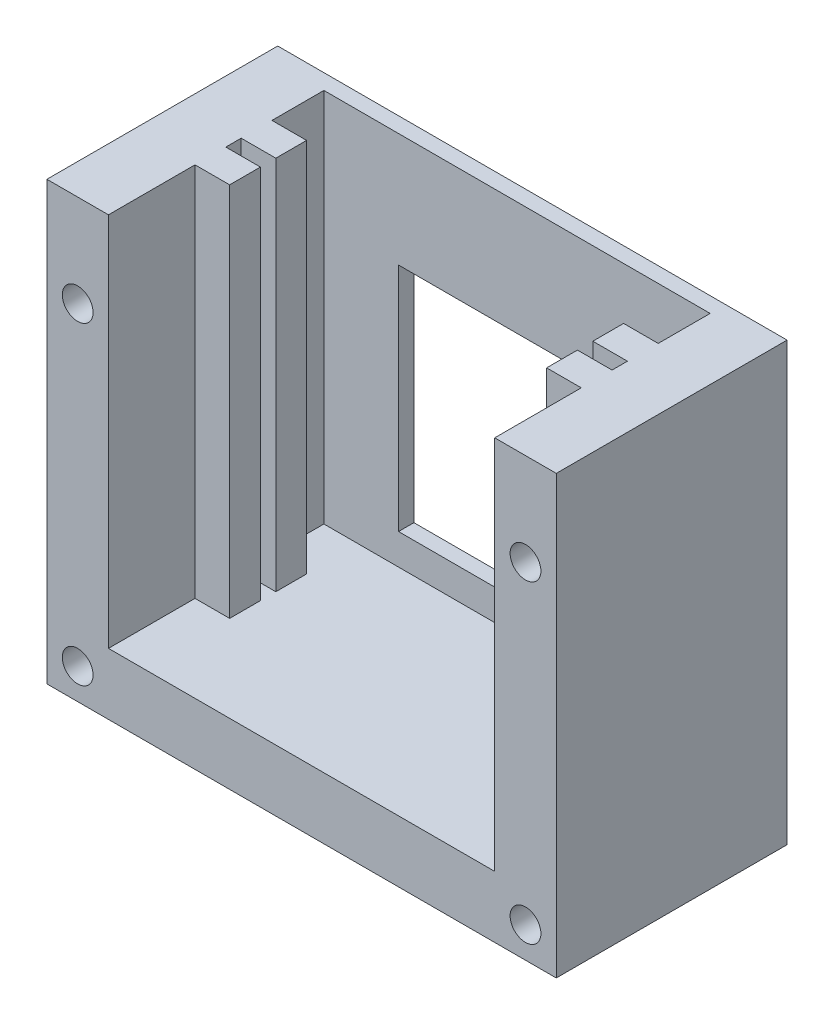
ISO-10303-21;
HEADER;
FILE_DESCRIPTION(('STEP AP214'),'2;1');
FILE_NAME('part.step','',(''),(''),'','','');
FILE_SCHEMA(('AUTOMOTIVE_DESIGN { 1 0 10303 214 1 1 1 1 }'));
ENDSEC;
DATA;
#1=APPLICATION_CONTEXT('core data for automotive mechanical design processes');
#2=APPLICATION_PROTOCOL_DEFINITION('international standard','automotive_design',2000,#1);
#3=PRODUCT_CONTEXT('',#1,'mechanical');
#4=PRODUCT('Part','Part','',(#3));
#5=PRODUCT_RELATED_PRODUCT_CATEGORY('part','',(#4));
#6=PRODUCT_DEFINITION_FORMATION('','',#4);
#7=PRODUCT_DEFINITION_CONTEXT('part definition',#1,'design');
#8=PRODUCT_DEFINITION('design','',#6,#7);
#9=PRODUCT_DEFINITION_SHAPE('','',#8);
#10=(LENGTH_UNIT() NAMED_UNIT(*) SI_UNIT(.MILLI.,.METRE.));
#11=(NAMED_UNIT(*) PLANE_ANGLE_UNIT() SI_UNIT($,.RADIAN.));
#12=(NAMED_UNIT(*) SI_UNIT($,.STERADIAN.) SOLID_ANGLE_UNIT());
#13=UNCERTAINTY_MEASURE_WITH_UNIT(LENGTH_MEASURE(1.E-05),#10,'distance_accuracy_value','');
#14=(GEOMETRIC_REPRESENTATION_CONTEXT(3) GLOBAL_UNCERTAINTY_ASSIGNED_CONTEXT((#13)) GLOBAL_UNIT_ASSIGNED_CONTEXT((#10,
#11,#12)) REPRESENTATION_CONTEXT('',''));
#15=CARTESIAN_POINT('',(0.,0.,0.));
#16=DIRECTION('',(0.,0.,1.));
#17=DIRECTION('',(1.,0.,0.));
#18=AXIS2_PLACEMENT_3D('',#15,#16,#17);
#19=CARTESIAN_POINT('',(-14.35,8.9,-17.));
#20=DIRECTION('',(0.,0.,1.));
#21=DIRECTION('',(1.,0.,0.));
#22=AXIS2_PLACEMENT_3D('',#19,#20,#21);
#23=CYLINDRICAL_SURFACE('',#22,1.);
#24=CARTESIAN_POINT('',(-14.35,8.9,-15.));
#25=DIRECTION('',(0.,0.,-1.));
#26=DIRECTION('',(-1.,0.,0.));
#27=AXIS2_PLACEMENT_3D('',#24,#25,#26);
#28=CIRCLE('',#27,1.);
#29=CARTESIAN_POINT('',(-15.35,8.9,-15.));
#30=VERTEX_POINT('',#29);
#31=EDGE_CURVE('E355',#30,#30,#28,.T.);
#32=ORIENTED_EDGE('',*,*,#31,.T.);
#33=EDGE_LOOP('',(#32));
#34=FACE_BOUND('',#33,.T.);
#35=CARTESIAN_POINT('',(-14.35,8.9,0.));
#36=DIRECTION('',(0.,0.,1.));
#37=DIRECTION('',(1.,0.,0.));
#38=AXIS2_PLACEMENT_3D('',#35,#36,#37);
#39=CIRCLE('',#38,1.);
#40=CARTESIAN_POINT('',(-13.35,8.9,0.));
#41=VERTEX_POINT('',#40);
#42=EDGE_CURVE('E360',#41,#41,#39,.F.);
#43=ORIENTED_EDGE('',*,*,#42,.F.);
#44=EDGE_LOOP('',(#43));
#45=FACE_BOUND('',#44,.T.);
#46=ADVANCED_FACE('F40',(#34,#45),#23,.F.);
#47=CARTESIAN_POINT('',(-14.35,-11.5,-17.));
#48=DIRECTION('',(0.,0.,1.));
#49=DIRECTION('',(1.,0.,0.));
#50=AXIS2_PLACEMENT_3D('',#47,#48,#49);
#51=CYLINDRICAL_SURFACE('',#50,1.);
#52=CARTESIAN_POINT('',(-14.35,-11.5,-15.));
#53=DIRECTION('',(0.,0.,-1.));
#54=DIRECTION('',(-1.,0.,0.));
#55=AXIS2_PLACEMENT_3D('',#52,#53,#54);
#56=CIRCLE('',#55,1.);
#57=CARTESIAN_POINT('',(-15.35,-11.5,-15.));
#58=VERTEX_POINT('',#57);
#59=EDGE_CURVE('E359',#58,#58,#56,.T.);
#60=ORIENTED_EDGE('',*,*,#59,.T.);
#61=EDGE_LOOP('',(#60));
#62=FACE_BOUND('',#61,.T.);
#63=CARTESIAN_POINT('',(-14.35,-11.5,0.));
#64=DIRECTION('',(0.,0.,1.));
#65=DIRECTION('',(1.,0.,0.));
#66=AXIS2_PLACEMENT_3D('',#63,#64,#65);
#67=CIRCLE('',#66,1.);
#68=CARTESIAN_POINT('',(-13.35,-11.5,0.));
#69=VERTEX_POINT('',#68);
#70=EDGE_CURVE('E1050',#69,#69,#67,.F.);
#71=ORIENTED_EDGE('',*,*,#70,.F.);
#72=EDGE_LOOP('',(#71));
#73=FACE_BOUND('',#72,.T.);
#74=ADVANCED_FACE('F620',(#62,#73),#51,.F.);
#75=CARTESIAN_POINT('',(14.75,-11.5,-17.));
#76=DIRECTION('',(0.,0.,1.));
#77=DIRECTION('',(1.,0.,0.));
#78=AXIS2_PLACEMENT_3D('',#75,#76,#77);
#79=CYLINDRICAL_SURFACE('',#78,1.);
#80=CARTESIAN_POINT('',(14.75,-11.5,-15.));
#81=DIRECTION('',(0.,0.,-1.));
#82=DIRECTION('',(-1.,0.,0.));
#83=AXIS2_PLACEMENT_3D('',#80,#81,#82);
#84=CIRCLE('',#83,1.);
#85=CARTESIAN_POINT('',(13.75,-11.5,-15.));
#86=VERTEX_POINT('',#85);
#87=EDGE_CURVE('E364',#86,#86,#84,.T.);
#88=ORIENTED_EDGE('',*,*,#87,.T.);
#89=EDGE_LOOP('',(#88));
#90=FACE_BOUND('',#89,.T.);
#91=CARTESIAN_POINT('',(14.75,-11.5,0.));
#92=DIRECTION('',(0.,0.,1.));
#93=DIRECTION('',(1.,0.,0.));
#94=AXIS2_PLACEMENT_3D('',#91,#92,#93);
#95=CIRCLE('',#94,1.);
#96=CARTESIAN_POINT('',(15.75,-11.5,0.));
#97=VERTEX_POINT('',#96);
#98=EDGE_CURVE('E1047',#97,#97,#95,.F.);
#99=ORIENTED_EDGE('',*,*,#98,.F.);
#100=EDGE_LOOP('',(#99));
#101=FACE_BOUND('',#100,.T.);
#102=ADVANCED_FACE('F627',(#90,#101),#79,.F.);
#103=CARTESIAN_POINT('',(14.75,8.9,-17.));
#104=DIRECTION('',(0.,0.,1.));
#105=DIRECTION('',(1.,0.,0.));
#106=AXIS2_PLACEMENT_3D('',#103,#104,#105);
#107=CYLINDRICAL_SURFACE('',#106,1.);
#108=CARTESIAN_POINT('',(14.75,8.9,-15.));
#109=DIRECTION('',(0.,0.,-1.));
#110=DIRECTION('',(-1.,0.,0.));
#111=AXIS2_PLACEMENT_3D('',#108,#109,#110);
#112=CIRCLE('',#111,1.);
#113=CARTESIAN_POINT('',(13.75,8.9,-15.));
#114=VERTEX_POINT('',#113);
#115=EDGE_CURVE('E367',#114,#114,#112,.T.);
#116=ORIENTED_EDGE('',*,*,#115,.T.);
#117=EDGE_LOOP('',(#116));
#118=FACE_BOUND('',#117,.T.);
#119=CARTESIAN_POINT('',(14.75,8.9,0.));
#120=DIRECTION('',(0.,0.,1.));
#121=DIRECTION('',(1.,0.,0.));
#122=AXIS2_PLACEMENT_3D('',#119,#120,#121);
#123=CIRCLE('',#122,1.);
#124=CARTESIAN_POINT('',(15.75,8.9,0.));
#125=VERTEX_POINT('',#124);
#126=EDGE_CURVE('E44',#125,#125,#123,.F.);
#127=ORIENTED_EDGE('',*,*,#126,.F.);
#128=EDGE_LOOP('',(#127));
#129=FACE_BOUND('',#128,.T.);
#130=ADVANCED_FACE('F633',(#118,#129),#107,.F.);
#131=CARTESIAN_POINT('',(0.,-9.5,-15.));
#132=DIRECTION('',(0.,1.,0.));
#133=DIRECTION('',(0.,0.,1.));
#134=AXIS2_PLACEMENT_3D('',#131,#132,#133);
#135=PLANE('',#134);
#136=DIRECTION('',(0.,0.,1.));
#137=VECTOR('',#136,1.);
#138=CARTESIAN_POINT('',(12.75,-9.5,-15.));
#139=LINE('',#138,#137);
#140=CARTESIAN_POINT('',(12.75,-9.5,-14.));
#141=VERTEX_POINT('',#140);
#142=CARTESIAN_POINT('',(12.75,-9.5,-10.625));
#143=VERTEX_POINT('',#142);
#144=EDGE_CURVE('E308',#141,#143,#139,.T.);
#145=ORIENTED_EDGE('',*,*,#144,.F.);
#146=DIRECTION('',(-1.,0.,0.));
#147=VECTOR('',#146,1.);
#148=CARTESIAN_POINT('',(0.,-9.5,-14.));
#149=LINE('',#148,#147);
#150=CARTESIAN_POINT('',(-12.35,-9.5,-14.));
#151=VERTEX_POINT('',#150);
#152=EDGE_CURVE('E433',#141,#151,#149,.T.);
#153=ORIENTED_EDGE('',*,*,#152,.T.);
#154=DIRECTION('',(0.,0.,1.));
#155=VECTOR('',#154,1.);
#156=CARTESIAN_POINT('',(-12.35,-9.5,-15.));
#157=LINE('',#156,#155);
#158=CARTESIAN_POINT('',(-12.35,-9.5,-10.625));
#159=VERTEX_POINT('',#158);
#160=EDGE_CURVE('E313',#151,#159,#157,.T.);
#161=ORIENTED_EDGE('',*,*,#160,.T.);
#162=DIRECTION('',(-1.,0.,0.));
#163=VECTOR('',#162,1.);
#164=CARTESIAN_POINT('',(0.,-9.5,-10.625));
#165=LINE('',#164,#163);
#166=CARTESIAN_POINT('',(-10.1,-9.5,-10.625));
#167=VERTEX_POINT('',#166);
#168=EDGE_CURVE('E523',#167,#159,#165,.T.);
#169=ORIENTED_EDGE('',*,*,#168,.F.);
#170=DIRECTION('',(0.,0.,-1.));
#171=VECTOR('',#170,1.);
#172=CARTESIAN_POINT('',(-10.1,-9.5,-15.));
#173=LINE('',#172,#171);
#174=CARTESIAN_POINT('',(-10.1,-9.5,-8.625));
#175=VERTEX_POINT('',#174);
#176=EDGE_CURVE('E541',#175,#167,#173,.T.);
#177=ORIENTED_EDGE('',*,*,#176,.F.);
#178=DIRECTION('',(-1.,0.,0.));
#179=VECTOR('',#178,1.);
#180=CARTESIAN_POINT('',(0.,-9.5,-8.625));
#181=LINE('',#180,#179);
#182=CARTESIAN_POINT('',(-12.35,-9.5,-8.625));
#183=VERTEX_POINT('',#182);
#184=EDGE_CURVE('E537',#175,#183,#181,.T.);
#185=ORIENTED_EDGE('',*,*,#184,.T.);
#186=CARTESIAN_POINT('',(-12.35,-9.5,-7.625));
#187=VERTEX_POINT('',#186);
#188=EDGE_CURVE('E317',#183,#187,#157,.T.);
#189=ORIENTED_EDGE('',*,*,#188,.T.);
#190=DIRECTION('',(-1.,0.,0.));
#191=VECTOR('',#190,1.);
#192=CARTESIAN_POINT('',(0.,-9.5,-7.625));
#193=LINE('',#192,#191);
#194=CARTESIAN_POINT('',(-10.1,-9.5,-7.625));
#195=VERTEX_POINT('',#194);
#196=EDGE_CURVE('E334',#195,#187,#193,.T.);
#197=ORIENTED_EDGE('',*,*,#196,.F.);
#198=DIRECTION('',(0.,0.,1.));
#199=VECTOR('',#198,1.);
#200=CARTESIAN_POINT('',(-10.1,-9.5,-15.));
#201=LINE('',#200,#199);
#202=CARTESIAN_POINT('',(-10.1,-9.5,-5.625));
#203=VERTEX_POINT('',#202);
#204=EDGE_CURVE('E330',#195,#203,#201,.T.);
#205=ORIENTED_EDGE('',*,*,#204,.T.);
#206=DIRECTION('',(-1.,0.,0.));
#207=VECTOR('',#206,1.);
#208=CARTESIAN_POINT('',(0.,-9.5,-5.62500000000001));
#209=LINE('',#208,#207);
#210=CARTESIAN_POINT('',(-12.35,-9.5,-5.625));
#211=VERTEX_POINT('',#210);
#212=EDGE_CURVE('E338',#203,#211,#209,.T.);
#213=ORIENTED_EDGE('',*,*,#212,.T.);
#214=CARTESIAN_POINT('',(-12.35,-9.5,0.));
#215=VERTEX_POINT('',#214);
#216=EDGE_CURVE('E311',#211,#215,#157,.T.);
#217=ORIENTED_EDGE('',*,*,#216,.T.);
#218=DIRECTION('',(-1.,0.,0.));
#219=VECTOR('',#218,1.);
#220=CARTESIAN_POINT('',(0.,-9.5,0.));
#221=LINE('',#220,#219);
#222=CARTESIAN_POINT('',(12.75,-9.5,0.));
#223=VERTEX_POINT('',#222);
#224=EDGE_CURVE('E295',#223,#215,#221,.T.);
#225=ORIENTED_EDGE('',*,*,#224,.F.);
#226=CARTESIAN_POINT('',(12.75,-9.5,-5.625));
#227=VERTEX_POINT('',#226);
#228=EDGE_CURVE('E305',#227,#223,#139,.T.);
#229=ORIENTED_EDGE('',*,*,#228,.F.);
#230=DIRECTION('',(1.,0.,0.));
#231=VECTOR('',#230,1.);
#232=CARTESIAN_POINT('',(10.5,-9.5,-5.625));
#233=LINE('',#232,#231);
#234=CARTESIAN_POINT('',(10.5,-9.5,-5.625));
#235=VERTEX_POINT('',#234);
#236=EDGE_CURVE('E466',#235,#227,#233,.T.);
#237=ORIENTED_EDGE('',*,*,#236,.F.);
#238=DIRECTION('',(0.,0.,1.));
#239=VECTOR('',#238,1.);
#240=CARTESIAN_POINT('',(10.5,-9.5,-7.625));
#241=LINE('',#240,#239);
#242=CARTESIAN_POINT('',(10.5,-9.5,-7.625));
#243=VERTEX_POINT('',#242);
#244=EDGE_CURVE('E445',#243,#235,#241,.T.);
#245=ORIENTED_EDGE('',*,*,#244,.F.);
#246=DIRECTION('',(1.,0.,0.));
#247=VECTOR('',#246,1.);
#248=CARTESIAN_POINT('',(10.5,-9.5,-7.625));
#249=LINE('',#248,#247);
#250=CARTESIAN_POINT('',(12.75,-9.5,-7.625));
#251=VERTEX_POINT('',#250);
#252=EDGE_CURVE('E469',#243,#251,#249,.T.);
#253=ORIENTED_EDGE('',*,*,#252,.T.);
#254=CARTESIAN_POINT('',(12.75,-9.5,-8.625));
#255=VERTEX_POINT('',#254);
#256=EDGE_CURVE('E312',#255,#251,#139,.T.);
#257=ORIENTED_EDGE('',*,*,#256,.F.);
#258=DIRECTION('',(1.,0.,0.));
#259=VECTOR('',#258,1.);
#260=CARTESIAN_POINT('',(10.5,-9.5,-8.625));
#261=LINE('',#260,#259);
#262=CARTESIAN_POINT('',(10.5,-9.5,-8.625));
#263=VERTEX_POINT('',#262);
#264=EDGE_CURVE('E500',#263,#255,#261,.T.);
#265=ORIENTED_EDGE('',*,*,#264,.F.);
#266=DIRECTION('',(0.,0.,1.));
#267=VECTOR('',#266,1.);
#268=CARTESIAN_POINT('',(10.5,-9.5,-10.625));
#269=LINE('',#268,#267);
#270=CARTESIAN_POINT('',(10.5,-9.5,-10.625));
#271=VERTEX_POINT('',#270);
#272=EDGE_CURVE('E477',#271,#263,#269,.T.);
#273=ORIENTED_EDGE('',*,*,#272,.F.);
#274=DIRECTION('',(1.,0.,0.));
#275=VECTOR('',#274,1.);
#276=CARTESIAN_POINT('',(10.5,-9.5,-10.625));
#277=LINE('',#276,#275);
#278=EDGE_CURVE('E503',#271,#143,#277,.T.);
#279=ORIENTED_EDGE('',*,*,#278,.T.);
#280=EDGE_LOOP('',(#145,#153,#161,#169,#177,#185,#189,#197,#205,#213,#217,#225,#229,#237,#245,
#253,#257,#265,#273,#279));
#281=FACE_BOUND('',#280,.T.);
#282=ADVANCED_FACE('F598',(#281),#135,.T.);
#283=CARTESIAN_POINT('',(12.75,0.,-15.));
#284=DIRECTION('',(-1.,0.,0.));
#285=DIRECTION('',(0.,-1.,0.));
#286=AXIS2_PLACEMENT_3D('',#283,#284,#285);
#287=PLANE('',#286);
#288=DIRECTION('',(0.,0.,1.));
#289=VECTOR('',#288,1.);
#290=CARTESIAN_POINT('',(12.75,14.9,-15.));
#291=LINE('',#290,#289);
#292=CARTESIAN_POINT('',(12.75,14.9,-14.));
#293=VERTEX_POINT('',#292);
#294=CARTESIAN_POINT('',(12.75,14.9,-10.625));
#295=VERTEX_POINT('',#294);
#296=EDGE_CURVE('E302',#293,#295,#291,.T.);
#297=ORIENTED_EDGE('',*,*,#296,.F.);
#298=DIRECTION('',(0.,-1.,0.));
#299=VECTOR('',#298,1.);
#300=CARTESIAN_POINT('',(12.75,0.,-14.));
#301=LINE('',#300,#299);
#302=EDGE_CURVE('E437',#293,#141,#301,.T.);
#303=ORIENTED_EDGE('',*,*,#302,.T.);
#304=ORIENTED_EDGE('',*,*,#144,.T.);
#305=DIRECTION('',(0.,-1.,0.));
#306=VECTOR('',#305,1.);
#307=CARTESIAN_POINT('',(12.75,14.9,-10.625));
#308=LINE('',#307,#306);
#309=EDGE_CURVE('E473',#295,#143,#308,.T.);
#310=ORIENTED_EDGE('',*,*,#309,.F.);
#311=EDGE_LOOP('',(#297,#303,#304,#310));
#312=FACE_BOUND('',#311,.T.);
#313=ADVANCED_FACE('F724',(#312),#287,.T.);
#314=CARTESIAN_POINT('',(-12.35,0.,-15.));
#315=DIRECTION('',(-1.,0.,0.));
#316=DIRECTION('',(0.,-1.,0.));
#317=AXIS2_PLACEMENT_3D('',#314,#315,#316);
#318=PLANE('',#317);
#319=DIRECTION('',(0.,-1.,0.));
#320=VECTOR('',#319,1.);
#321=CARTESIAN_POINT('',(-12.35,0.,-14.));
#322=LINE('',#321,#320);
#323=CARTESIAN_POINT('',(-12.35,14.9,-14.));
#324=VERTEX_POINT('',#323);
#325=EDGE_CURVE('E342',#324,#151,#322,.T.);
#326=ORIENTED_EDGE('',*,*,#325,.F.);
#327=DIRECTION('',(0.,0.,1.));
#328=VECTOR('',#327,1.);
#329=CARTESIAN_POINT('',(-12.35,14.9,-15.));
#330=LINE('',#329,#328);
#331=CARTESIAN_POINT('',(-12.35,14.9,-10.625));
#332=VERTEX_POINT('',#331);
#333=EDGE_CURVE('E318',#324,#332,#330,.T.);
#334=ORIENTED_EDGE('',*,*,#333,.T.);
#335=DIRECTION('',(0.,-1.,0.));
#336=VECTOR('',#335,1.);
#337=CARTESIAN_POINT('',(-12.35,14.9,-10.625));
#338=LINE('',#337,#336);
#339=EDGE_CURVE('E515',#332,#159,#338,.T.);
#340=ORIENTED_EDGE('',*,*,#339,.T.);
#341=ORIENTED_EDGE('',*,*,#160,.F.);
#342=EDGE_LOOP('',(#326,#334,#340,#341));
#343=FACE_BOUND('',#342,.T.);
#344=ADVANCED_FACE('F727',(#343),#318,.F.);
#345=ORIENTED_EDGE('',*,*,#256,.T.);
#346=DIRECTION('',(0.,-1.,0.));
#347=VECTOR('',#346,1.);
#348=CARTESIAN_POINT('',(12.75,14.9,-7.625));
#349=LINE('',#348,#347);
#350=CARTESIAN_POINT('',(12.75,14.9,-7.625));
#351=VERTEX_POINT('',#350);
#352=EDGE_CURVE('E441',#351,#251,#349,.T.);
#353=ORIENTED_EDGE('',*,*,#352,.F.);
#354=CARTESIAN_POINT('',(12.75,14.9,-8.62500000000001));
#355=VERTEX_POINT('',#354);
#356=EDGE_CURVE('E306',#355,#351,#291,.T.);
#357=ORIENTED_EDGE('',*,*,#356,.F.);
#358=DIRECTION('',(0.,1.,0.));
#359=VECTOR('',#358,1.);
#360=CARTESIAN_POINT('',(12.75,14.9,-8.62500000000001));
#361=LINE('',#360,#359);
#362=EDGE_CURVE('E478',#255,#355,#361,.T.);
#363=ORIENTED_EDGE('',*,*,#362,.F.);
#364=EDGE_LOOP('',(#345,#353,#357,#363));
#365=FACE_BOUND('',#364,.T.);
#366=ADVANCED_FACE('F729',(#365),#287,.T.);
#367=CARTESIAN_POINT('',(12.75,14.9,-5.625));
#368=VERTEX_POINT('',#367);
#369=CARTESIAN_POINT('',(12.75,14.9,0.));
#370=VERTEX_POINT('',#369);
#371=EDGE_CURVE('E307',#368,#370,#291,.T.);
#372=ORIENTED_EDGE('',*,*,#371,.F.);
#373=DIRECTION('',(0.,1.,0.));
#374=VECTOR('',#373,1.);
#375=CARTESIAN_POINT('',(12.75,14.9,-5.62500000000001));
#376=LINE('',#375,#374);
#377=EDGE_CURVE('E446',#227,#368,#376,.T.);
#378=ORIENTED_EDGE('',*,*,#377,.F.);
#379=ORIENTED_EDGE('',*,*,#228,.T.);
#380=DIRECTION('',(0.,-1.,0.));
#381=VECTOR('',#380,1.);
#382=CARTESIAN_POINT('',(12.75,0.,0.));
#383=LINE('',#382,#381);
#384=EDGE_CURVE('E298',#370,#223,#383,.T.);
#385=ORIENTED_EDGE('',*,*,#384,.F.);
#386=EDGE_LOOP('',(#372,#378,#379,#385));
#387=FACE_BOUND('',#386,.T.);
#388=ADVANCED_FACE('F590',(#387),#287,.T.);
#389=DIRECTION('',(0.,-1.,0.));
#390=VECTOR('',#389,1.);
#391=CARTESIAN_POINT('',(-12.35,14.9,-8.625));
#392=LINE('',#391,#390);
#393=CARTESIAN_POINT('',(-12.35,14.9,-8.625));
#394=VERTEX_POINT('',#393);
#395=EDGE_CURVE('E519',#394,#183,#392,.T.);
#396=ORIENTED_EDGE('',*,*,#395,.F.);
#397=CARTESIAN_POINT('',(-12.35,14.9,-7.625));
#398=VERTEX_POINT('',#397);
#399=EDGE_CURVE('E321',#394,#398,#330,.T.);
#400=ORIENTED_EDGE('',*,*,#399,.T.);
#401=DIRECTION('',(0.,-1.,0.));
#402=VECTOR('',#401,1.);
#403=CARTESIAN_POINT('',(-12.35,14.9,-7.625));
#404=LINE('',#403,#402);
#405=EDGE_CURVE('E544',#398,#187,#404,.T.);
#406=ORIENTED_EDGE('',*,*,#405,.T.);
#407=ORIENTED_EDGE('',*,*,#188,.F.);
#408=EDGE_LOOP('',(#396,#400,#406,#407));
#409=FACE_BOUND('',#408,.T.);
#410=ADVANCED_FACE('F735',(#409),#318,.F.);
#411=DIRECTION('',(0.,-1.,0.));
#412=VECTOR('',#411,1.);
#413=CARTESIAN_POINT('',(-12.35,14.9,-5.625));
#414=LINE('',#413,#412);
#415=CARTESIAN_POINT('',(-12.35,14.9,-5.625));
#416=VERTEX_POINT('',#415);
#417=EDGE_CURVE('E550',#416,#211,#414,.T.);
#418=ORIENTED_EDGE('',*,*,#417,.F.);
#419=CARTESIAN_POINT('',(-12.35,14.9,0.));
#420=VERTEX_POINT('',#419);
#421=EDGE_CURVE('E316',#416,#420,#330,.T.);
#422=ORIENTED_EDGE('',*,*,#421,.T.);
#423=DIRECTION('',(0.,-1.,0.));
#424=VECTOR('',#423,1.);
#425=CARTESIAN_POINT('',(-12.35,0.,0.));
#426=LINE('',#425,#424);
#427=EDGE_CURVE('E291',#420,#215,#426,.T.);
#428=ORIENTED_EDGE('',*,*,#427,.T.);
#429=ORIENTED_EDGE('',*,*,#216,.F.);
#430=EDGE_LOOP('',(#418,#422,#428,#429));
#431=FACE_BOUND('',#430,.T.);
#432=ADVANCED_FACE('F604',(#431),#318,.F.);
#433=CARTESIAN_POINT('',(0.,14.9,-15.));
#434=DIRECTION('',(0.,1.,0.));
#435=DIRECTION('',(0.,0.,1.));
#436=AXIS2_PLACEMENT_3D('',#433,#434,#435);
#437=PLANE('',#436);
#438=DIRECTION('',(-1.,0.,0.));
#439=VECTOR('',#438,1.);
#440=CARTESIAN_POINT('',(0.,14.9,-15.));
#441=LINE('',#440,#439);
#442=CARTESIAN_POINT('',(16.75,14.9,-15.));
#443=VERTEX_POINT('',#442);
#444=CARTESIAN_POINT('',(-16.35,14.9,-15.));
#445=VERTEX_POINT('',#444);
#446=EDGE_CURVE('E301',#443,#445,#441,.T.);
#447=ORIENTED_EDGE('',*,*,#446,.T.);
#448=DIRECTION('',(0.,0.,1.));
#449=VECTOR('',#448,1.);
#450=CARTESIAN_POINT('',(-16.35,14.9,-15.));
#451=LINE('',#450,#449);
#452=CARTESIAN_POINT('',(-16.35,14.9,0.));
#453=VERTEX_POINT('',#452);
#454=EDGE_CURVE('E276',#445,#453,#451,.T.);
#455=ORIENTED_EDGE('',*,*,#454,.T.);
#456=DIRECTION('',(1.,0.,0.));
#457=VECTOR('',#456,1.);
#458=CARTESIAN_POINT('',(0.,14.9,0.));
#459=LINE('',#458,#457);
#460=EDGE_CURVE('E260',#453,#420,#459,.T.);
#461=ORIENTED_EDGE('',*,*,#460,.T.);
#462=ORIENTED_EDGE('',*,*,#421,.F.);
#463=DIRECTION('',(-1.,0.,0.));
#464=VECTOR('',#463,1.);
#465=CARTESIAN_POINT('',(-10.1,14.9,-5.625));
#466=LINE('',#465,#464);
#467=CARTESIAN_POINT('',(-10.1,14.9,-5.625));
#468=VERTEX_POINT('',#467);
#469=EDGE_CURVE('E563',#468,#416,#466,.T.);
#470=ORIENTED_EDGE('',*,*,#469,.F.);
#471=DIRECTION('',(0.,0.,-1.));
#472=VECTOR('',#471,1.);
#473=CARTESIAN_POINT('',(-10.1,14.9,-5.625));
#474=LINE('',#473,#472);
#475=CARTESIAN_POINT('',(-10.1,14.9,-7.625));
#476=VERTEX_POINT('',#475);
#477=EDGE_CURVE('E545',#468,#476,#474,.T.);
#478=ORIENTED_EDGE('',*,*,#477,.T.);
#479=DIRECTION('',(-1.,0.,0.));
#480=VECTOR('',#479,1.);
#481=CARTESIAN_POINT('',(-10.1,14.9,-7.625));
#482=LINE('',#481,#480);
#483=EDGE_CURVE('E557',#476,#398,#482,.T.);
#484=ORIENTED_EDGE('',*,*,#483,.T.);
#485=ORIENTED_EDGE('',*,*,#399,.F.);
#486=DIRECTION('',(-1.,0.,0.));
#487=VECTOR('',#486,1.);
#488=CARTESIAN_POINT('',(-10.1,14.9,-8.625));
#489=LINE('',#488,#487);
#490=CARTESIAN_POINT('',(-10.1,14.9,-8.625));
#491=VERTEX_POINT('',#490);
#492=EDGE_CURVE('E507',#491,#394,#489,.T.);
#493=ORIENTED_EDGE('',*,*,#492,.F.);
#494=DIRECTION('',(0.,0.,1.));
#495=VECTOR('',#494,1.);
#496=CARTESIAN_POINT('',(-10.1,14.9,-10.625));
#497=LINE('',#496,#495);
#498=CARTESIAN_POINT('',(-10.1,14.9,-10.625));
#499=VERTEX_POINT('',#498);
#500=EDGE_CURVE('E520',#499,#491,#497,.T.);
#501=ORIENTED_EDGE('',*,*,#500,.F.);
#502=DIRECTION('',(-1.,0.,0.));
#503=VECTOR('',#502,1.);
#504=CARTESIAN_POINT('',(-10.1,14.9,-10.625));
#505=LINE('',#504,#503);
#506=EDGE_CURVE('E510',#499,#332,#505,.T.);
#507=ORIENTED_EDGE('',*,*,#506,.T.);
#508=ORIENTED_EDGE('',*,*,#333,.F.);
#509=DIRECTION('',(1.,0.,0.));
#510=VECTOR('',#509,1.);
#511=CARTESIAN_POINT('',(16.75,14.9,-14.));
#512=LINE('',#511,#510);
#513=EDGE_CURVE('E421',#324,#293,#512,.T.);
#514=ORIENTED_EDGE('',*,*,#513,.T.);
#515=ORIENTED_EDGE('',*,*,#296,.T.);
#516=DIRECTION('',(1.,0.,0.));
#517=VECTOR('',#516,1.);
#518=CARTESIAN_POINT('',(10.5,14.9,-10.625));
#519=LINE('',#518,#517);
#520=CARTESIAN_POINT('',(10.5,14.9,-10.625));
#521=VERTEX_POINT('',#520);
#522=EDGE_CURVE('E487',#521,#295,#519,.T.);
#523=ORIENTED_EDGE('',*,*,#522,.F.);
#524=DIRECTION('',(0.,0.,-1.));
#525=VECTOR('',#524,1.);
#526=CARTESIAN_POINT('',(10.5,14.9,-10.625));
#527=LINE('',#526,#525);
#528=CARTESIAN_POINT('',(10.5,14.9,-8.62500000000001));
#529=VERTEX_POINT('',#528);
#530=EDGE_CURVE('E484',#529,#521,#527,.T.);
#531=ORIENTED_EDGE('',*,*,#530,.F.);
#532=DIRECTION('',(1.,0.,0.));
#533=VECTOR('',#532,1.);
#534=CARTESIAN_POINT('',(10.5,14.9,-8.62500000000001));
#535=LINE('',#534,#533);
#536=EDGE_CURVE('E497',#529,#355,#535,.T.);
#537=ORIENTED_EDGE('',*,*,#536,.T.);
#538=ORIENTED_EDGE('',*,*,#356,.T.);
#539=DIRECTION('',(1.,0.,0.));
#540=VECTOR('',#539,1.);
#541=CARTESIAN_POINT('',(10.5,14.9,-7.625));
#542=LINE('',#541,#540);
#543=CARTESIAN_POINT('',(10.5,14.9,-7.625));
#544=VERTEX_POINT('',#543);
#545=EDGE_CURVE('E455',#544,#351,#542,.T.);
#546=ORIENTED_EDGE('',*,*,#545,.F.);
#547=DIRECTION('',(0.,0.,-1.));
#548=VECTOR('',#547,1.);
#549=CARTESIAN_POINT('',(10.5,14.9,-7.625));
#550=LINE('',#549,#548);
#551=CARTESIAN_POINT('',(10.5,14.9,-5.62500000000001));
#552=VERTEX_POINT('',#551);
#553=EDGE_CURVE('E452',#552,#544,#550,.T.);
#554=ORIENTED_EDGE('',*,*,#553,.F.);
#555=DIRECTION('',(1.,0.,0.));
#556=VECTOR('',#555,1.);
#557=CARTESIAN_POINT('',(10.5,14.9,-5.62500000000001));
#558=LINE('',#557,#556);
#559=EDGE_CURVE('E463',#552,#368,#558,.T.);
#560=ORIENTED_EDGE('',*,*,#559,.T.);
#561=ORIENTED_EDGE('',*,*,#371,.T.);
#562=DIRECTION('',(-1.,0.,0.));
#563=VECTOR('',#562,1.);
#564=CARTESIAN_POINT('',(0.,14.9,0.));
#565=LINE('',#564,#563);
#566=CARTESIAN_POINT('',(16.75,14.9,0.));
#567=VERTEX_POINT('',#566);
#568=EDGE_CURVE('E285',#567,#370,#565,.T.);
#569=ORIENTED_EDGE('',*,*,#568,.F.);
#570=DIRECTION('',(0.,0.,1.));
#571=VECTOR('',#570,1.);
#572=CARTESIAN_POINT('',(16.75,14.9,-15.));
#573=LINE('',#572,#571);
#574=EDGE_CURVE('E326',#443,#567,#573,.T.);
#575=ORIENTED_EDGE('',*,*,#574,.F.);
#576=EDGE_LOOP('',(#447,#455,#461,#462,#470,#478,#484,#485,#493,#501,#507,#508,#514,#515,#523,
#531,#537,#538,#546,#554,#560,#561,#569,#575));
#577=FACE_BOUND('',#576,.T.);
#578=ADVANCED_FACE('F42',(#577),#437,.T.);
#579=CARTESIAN_POINT('',(16.75,0.,-15.));
#580=DIRECTION('',(-1.,0.,0.));
#581=DIRECTION('',(0.,-1.,0.));
#582=AXIS2_PLACEMENT_3D('',#579,#580,#581);
#583=PLANE('',#582);
#584=ORIENTED_EDGE('',*,*,#574,.T.);
#585=DIRECTION('',(0.,-1.,0.));
#586=VECTOR('',#585,1.);
#587=CARTESIAN_POINT('',(16.75,0.,0.));
#588=LINE('',#587,#586);
#589=CARTESIAN_POINT('',(16.75,-13.5,0.));
#590=VERTEX_POINT('',#589);
#591=EDGE_CURVE('E282',#567,#590,#588,.T.);
#592=ORIENTED_EDGE('',*,*,#591,.T.);
#593=DIRECTION('',(0.,0.,1.));
#594=VECTOR('',#593,1.);
#595=CARTESIAN_POINT('',(16.75,-13.5,-15.));
#596=LINE('',#595,#594);
#597=CARTESIAN_POINT('',(16.75,-13.5,-15.));
#598=VERTEX_POINT('',#597);
#599=EDGE_CURVE('E275',#598,#590,#596,.T.);
#600=ORIENTED_EDGE('',*,*,#599,.F.);
#601=DIRECTION('',(0.,-1.,0.));
#602=VECTOR('',#601,1.);
#603=CARTESIAN_POINT('',(16.75,0.,-15.));
#604=LINE('',#603,#602);
#605=EDGE_CURVE('E571',#443,#598,#604,.T.);
#606=ORIENTED_EDGE('',*,*,#605,.F.);
#607=EDGE_LOOP('',(#584,#592,#600,#606));
#608=FACE_BOUND('',#607,.T.);
#609=ADVANCED_FACE('F611',(#608),#583,.F.);
#610=CARTESIAN_POINT('',(0.,-13.5,-15.));
#611=DIRECTION('',(0.,1.,0.));
#612=DIRECTION('',(0.,0.,1.));
#613=AXIS2_PLACEMENT_3D('',#610,#611,#612);
#614=PLANE('',#613);
#615=DIRECTION('',(1.,0.,0.));
#616=VECTOR('',#615,1.);
#617=CARTESIAN_POINT('',(-10.5,-13.5,-6.9));
#618=LINE('',#617,#616);
#619=CARTESIAN_POINT('',(-10.5,-13.5,-6.9));
#620=VERTEX_POINT('',#619);
#621=CARTESIAN_POINT('',(10.5,-13.5,-6.9));
#622=VERTEX_POINT('',#621);
#623=EDGE_CURVE('E373',#620,#622,#618,.T.);
#624=ORIENTED_EDGE('',*,*,#623,.F.);
#625=DIRECTION('',(0.,0.,-1.));
#626=VECTOR('',#625,1.);
#627=CARTESIAN_POINT('',(-10.5,-13.5,-4.4));
#628=LINE('',#627,#626);
#629=CARTESIAN_POINT('',(-10.5,-13.5,-4.4));
#630=VERTEX_POINT('',#629);
#631=EDGE_CURVE('E58',#630,#620,#628,.T.);
#632=ORIENTED_EDGE('',*,*,#631,.F.);
#633=DIRECTION('',(1.,0.,0.));
#634=VECTOR('',#633,1.);
#635=CARTESIAN_POINT('',(-10.5,-13.5,-4.4));
#636=LINE('',#635,#634);
#637=CARTESIAN_POINT('',(10.5,-13.5,-4.4));
#638=VERTEX_POINT('',#637);
#639=EDGE_CURVE('E386',#630,#638,#636,.T.);
#640=ORIENTED_EDGE('',*,*,#639,.T.);
#641=DIRECTION('',(0.,0.,-1.));
#642=VECTOR('',#641,1.);
#643=CARTESIAN_POINT('',(10.5,-13.5,-4.4));
#644=LINE('',#643,#642);
#645=EDGE_CURVE('E377',#638,#622,#644,.T.);
#646=ORIENTED_EDGE('',*,*,#645,.T.);
#647=EDGE_LOOP('',(#624,#632,#640,#646));
#648=FACE_BOUND('',#647,.T.);
#649=ORIENTED_EDGE('',*,*,#599,.T.);
#650=DIRECTION('',(-1.,0.,0.));
#651=VECTOR('',#650,1.);
#652=CARTESIAN_POINT('',(0.,-13.5,0.));
#653=LINE('',#652,#651);
#654=CARTESIAN_POINT('',(-16.35,-13.5,0.));
#655=VERTEX_POINT('',#654);
#656=EDGE_CURVE('E257',#590,#655,#653,.T.);
#657=ORIENTED_EDGE('',*,*,#656,.T.);
#658=DIRECTION('',(0.,0.,1.));
#659=VECTOR('',#658,1.);
#660=CARTESIAN_POINT('',(-16.35,-13.5,-15.));
#661=LINE('',#660,#659);
#662=CARTESIAN_POINT('',(-16.35,-13.5,-15.));
#663=VERTEX_POINT('',#662);
#664=EDGE_CURVE('E268',#663,#655,#661,.T.);
#665=ORIENTED_EDGE('',*,*,#664,.F.);
#666=DIRECTION('',(-1.,0.,0.));
#667=VECTOR('',#666,1.);
#668=CARTESIAN_POINT('',(0.,-13.5,-15.));
#669=LINE('',#668,#667);
#670=EDGE_CURVE('E574',#598,#663,#669,.T.);
#671=ORIENTED_EDGE('',*,*,#670,.F.);
#672=EDGE_LOOP('',(#649,#657,#665,#671));
#673=FACE_BOUND('',#672,.T.);
#674=ADVANCED_FACE('F278',(#648,#673),#614,.F.);
#675=CARTESIAN_POINT('',(-16.35,0.,-15.));
#676=DIRECTION('',(1.,0.,0.));
#677=DIRECTION('',(0.,0.,-1.));
#678=AXIS2_PLACEMENT_3D('',#675,#676,#677);
#679=PLANE('',#678);
#680=ORIENTED_EDGE('',*,*,#664,.T.);
#681=DIRECTION('',(0.,1.,0.));
#682=VECTOR('',#681,1.);
#683=CARTESIAN_POINT('',(-16.35,0.,0.));
#684=LINE('',#683,#682);
#685=EDGE_CURVE('E252',#655,#453,#684,.T.);
#686=ORIENTED_EDGE('',*,*,#685,.T.);
#687=ORIENTED_EDGE('',*,*,#454,.F.);
#688=DIRECTION('',(0.,1.,0.));
#689=VECTOR('',#688,1.);
#690=CARTESIAN_POINT('',(-16.35,0.,-15.));
#691=LINE('',#690,#689);
#692=EDGE_CURVE('E271',#663,#445,#691,.T.);
#693=ORIENTED_EDGE('',*,*,#692,.F.);
#694=EDGE_LOOP('',(#680,#686,#687,#693));
#695=FACE_BOUND('',#694,.T.);
#696=ADVANCED_FACE('F269',(#695),#679,.F.);
#697=CARTESIAN_POINT('',(0.,0.,-15.));
#698=DIRECTION('',(0.,0.,-1.));
#699=DIRECTION('',(-1.,0.,0.));
#700=AXIS2_PLACEMENT_3D('',#697,#698,#699);
#701=PLANE('',#700);
#702=ORIENTED_EDGE('',*,*,#115,.F.);
#703=EDGE_LOOP('',(#702));
#704=FACE_BOUND('',#703,.T.);
#705=ORIENTED_EDGE('',*,*,#87,.F.);
#706=EDGE_LOOP('',(#705));
#707=FACE_BOUND('',#706,.T.);
#708=ORIENTED_EDGE('',*,*,#59,.F.);
#709=EDGE_LOOP('',(#708));
#710=FACE_BOUND('',#709,.T.);
#711=ORIENTED_EDGE('',*,*,#31,.F.);
#712=EDGE_LOOP('',(#711));
#713=FACE_BOUND('',#712,.T.);
#714=DIRECTION('',(0.,-1.,0.));
#715=VECTOR('',#714,1.);
#716=CARTESIAN_POINT('',(7.5,7.5,-15.));
#717=LINE('',#716,#715);
#718=CARTESIAN_POINT('',(7.5,7.5,-15.));
#719=VERTEX_POINT('',#718);
#720=CARTESIAN_POINT('',(7.5,-7.5,-15.));
#721=VERTEX_POINT('',#720);
#722=EDGE_CURVE('E66',#719,#721,#717,.T.);
#723=ORIENTED_EDGE('',*,*,#722,.F.);
#724=DIRECTION('',(-1.,0.,0.));
#725=VECTOR('',#724,1.);
#726=CARTESIAN_POINT('',(7.5,7.5,-15.));
#727=LINE('',#726,#725);
#728=CARTESIAN_POINT('',(-7.5,7.5,-15.));
#729=VERTEX_POINT('',#728);
#730=EDGE_CURVE('E413',#719,#729,#727,.T.);
#731=ORIENTED_EDGE('',*,*,#730,.T.);
#732=DIRECTION('',(0.,-1.,0.));
#733=VECTOR('',#732,1.);
#734=CARTESIAN_POINT('',(-7.5,7.5,-15.));
#735=LINE('',#734,#733);
#736=CARTESIAN_POINT('',(-7.5,-7.5,-15.));
#737=VERTEX_POINT('',#736);
#738=EDGE_CURVE('E409',#729,#737,#735,.T.);
#739=ORIENTED_EDGE('',*,*,#738,.T.);
#740=DIRECTION('',(-1.,0.,0.));
#741=VECTOR('',#740,1.);
#742=CARTESIAN_POINT('',(7.5,-7.5,-15.));
#743=LINE('',#742,#741);
#744=EDGE_CURVE('E405',#721,#737,#743,.T.);
#745=ORIENTED_EDGE('',*,*,#744,.F.);
#746=EDGE_LOOP('',(#723,#731,#739,#745));
#747=FACE_BOUND('',#746,.T.);
#748=ORIENTED_EDGE('',*,*,#446,.F.);
#749=ORIENTED_EDGE('',*,*,#605,.T.);
#750=ORIENTED_EDGE('',*,*,#670,.T.);
#751=ORIENTED_EDGE('',*,*,#692,.T.);
#752=EDGE_LOOP('',(#748,#749,#750,#751));
#753=FACE_BOUND('',#752,.T.);
#754=ADVANCED_FACE('F609',(#704,#707,#710,#713,#747,#753),#701,.T.);
#755=CARTESIAN_POINT('',(-10.1,14.9,-5.625));
#756=DIRECTION('',(0.,0.,-1.));
#757=DIRECTION('',(0.,1.,0.));
#758=AXIS2_PLACEMENT_3D('',#755,#756,#757);
#759=PLANE('',#758);
#760=ORIENTED_EDGE('',*,*,#212,.F.);
#761=DIRECTION('',(0.,-1.,0.));
#762=VECTOR('',#761,1.);
#763=CARTESIAN_POINT('',(-10.1,14.9,-5.625));
#764=LINE('',#763,#762);
#765=EDGE_CURVE('E554',#468,#203,#764,.T.);
#766=ORIENTED_EDGE('',*,*,#765,.F.);
#767=ORIENTED_EDGE('',*,*,#469,.T.);
#768=ORIENTED_EDGE('',*,*,#417,.T.);
#769=EDGE_LOOP('',(#760,#766,#767,#768));
#770=FACE_BOUND('',#769,.T.);
#771=ADVANCED_FACE('F714',(#770),#759,.F.);
#772=CARTESIAN_POINT('',(-10.1,14.9,-7.625));
#773=DIRECTION('',(0.,0.,-1.));
#774=DIRECTION('',(0.,1.,0.));
#775=AXIS2_PLACEMENT_3D('',#772,#773,#774);
#776=PLANE('',#775);
#777=DIRECTION('',(0.,-1.,0.));
#778=VECTOR('',#777,1.);
#779=CARTESIAN_POINT('',(-10.1,14.9,-7.625));
#780=LINE('',#779,#778);
#781=EDGE_CURVE('E549',#476,#195,#780,.T.);
#782=ORIENTED_EDGE('',*,*,#781,.T.);
#783=ORIENTED_EDGE('',*,*,#196,.T.);
#784=ORIENTED_EDGE('',*,*,#405,.F.);
#785=ORIENTED_EDGE('',*,*,#483,.F.);
#786=EDGE_LOOP('',(#782,#783,#784,#785));
#787=FACE_BOUND('',#786,.T.);
#788=ADVANCED_FACE('F712',(#787),#776,.T.);
#789=CARTESIAN_POINT('',(-10.1,0.,0.));
#790=DIRECTION('',(-1.,0.,0.));
#791=DIRECTION('',(0.,-1.,0.));
#792=AXIS2_PLACEMENT_3D('',#789,#790,#791);
#793=PLANE('',#792);
#794=ORIENTED_EDGE('',*,*,#204,.F.);
#795=ORIENTED_EDGE('',*,*,#781,.F.);
#796=ORIENTED_EDGE('',*,*,#477,.F.);
#797=ORIENTED_EDGE('',*,*,#765,.T.);
#798=EDGE_LOOP('',(#794,#795,#796,#797));
#799=FACE_BOUND('',#798,.T.);
#800=ADVANCED_FACE('F702',(#799),#793,.F.);
#801=CARTESIAN_POINT('',(-10.1,14.9,-8.625));
#802=DIRECTION('',(0.,0.,-1.));
#803=DIRECTION('',(0.,1.,0.));
#804=AXIS2_PLACEMENT_3D('',#801,#802,#803);
#805=PLANE('',#804);
#806=ORIENTED_EDGE('',*,*,#184,.F.);
#807=DIRECTION('',(0.,-1.,0.));
#808=VECTOR('',#807,1.);
#809=CARTESIAN_POINT('',(-10.1,14.9,-8.625));
#810=LINE('',#809,#808);
#811=EDGE_CURVE('E527',#491,#175,#810,.T.);
#812=ORIENTED_EDGE('',*,*,#811,.F.);
#813=ORIENTED_EDGE('',*,*,#492,.T.);
#814=ORIENTED_EDGE('',*,*,#395,.T.);
#815=EDGE_LOOP('',(#806,#812,#813,#814));
#816=FACE_BOUND('',#815,.T.);
#817=ADVANCED_FACE('F698',(#816),#805,.F.);
#818=CARTESIAN_POINT('',(-10.1,14.9,-10.625));
#819=DIRECTION('',(0.,0.,-1.));
#820=DIRECTION('',(0.,1.,0.));
#821=AXIS2_PLACEMENT_3D('',#818,#819,#820);
#822=PLANE('',#821);
#823=DIRECTION('',(0.,-1.,0.));
#824=VECTOR('',#823,1.);
#825=CARTESIAN_POINT('',(-10.1,14.9,-10.625));
#826=LINE('',#825,#824);
#827=EDGE_CURVE('E514',#499,#167,#826,.T.);
#828=ORIENTED_EDGE('',*,*,#827,.T.);
#829=ORIENTED_EDGE('',*,*,#168,.T.);
#830=ORIENTED_EDGE('',*,*,#339,.F.);
#831=ORIENTED_EDGE('',*,*,#506,.F.);
#832=EDGE_LOOP('',(#828,#829,#830,#831));
#833=FACE_BOUND('',#832,.T.);
#834=ADVANCED_FACE('F701',(#833),#822,.T.);
#835=CARTESIAN_POINT('',(-10.1,0.,0.));
#836=DIRECTION('',(1.,0.,0.));
#837=DIRECTION('',(0.,1.,0.));
#838=AXIS2_PLACEMENT_3D('',#835,#836,#837);
#839=PLANE('',#838);
#840=ORIENTED_EDGE('',*,*,#811,.T.);
#841=ORIENTED_EDGE('',*,*,#176,.T.);
#842=ORIENTED_EDGE('',*,*,#827,.F.);
#843=ORIENTED_EDGE('',*,*,#500,.T.);
#844=EDGE_LOOP('',(#840,#841,#842,#843));
#845=FACE_BOUND('',#844,.T.);
#846=ADVANCED_FACE('F696',(#845),#839,.T.);
#847=CARTESIAN_POINT('',(10.5,14.9,-10.625));
#848=DIRECTION('',(0.,0.,1.));
#849=DIRECTION('',(0.,-1.,0.));
#850=AXIS2_PLACEMENT_3D('',#847,#848,#849);
#851=PLANE('',#850);
#852=ORIENTED_EDGE('',*,*,#309,.T.);
#853=ORIENTED_EDGE('',*,*,#278,.F.);
#854=DIRECTION('',(0.,-1.,0.));
#855=VECTOR('',#854,1.);
#856=CARTESIAN_POINT('',(10.5,14.9,-10.625));
#857=LINE('',#856,#855);
#858=EDGE_CURVE('E474',#521,#271,#857,.T.);
#859=ORIENTED_EDGE('',*,*,#858,.F.);
#860=ORIENTED_EDGE('',*,*,#522,.T.);
#861=EDGE_LOOP('',(#852,#853,#859,#860));
#862=FACE_BOUND('',#861,.T.);
#863=ADVANCED_FACE('F692',(#862),#851,.F.);
#864=CARTESIAN_POINT('',(10.5,14.9,-8.62500000000001));
#865=DIRECTION('',(0.,0.,-1.));
#866=DIRECTION('',(0.,1.,0.));
#867=AXIS2_PLACEMENT_3D('',#864,#865,#866);
#868=PLANE('',#867);
#869=ORIENTED_EDGE('',*,*,#362,.T.);
#870=ORIENTED_EDGE('',*,*,#536,.F.);
#871=DIRECTION('',(0.,1.,0.));
#872=VECTOR('',#871,1.);
#873=CARTESIAN_POINT('',(10.5,14.9,-8.62500000000001));
#874=LINE('',#873,#872);
#875=EDGE_CURVE('E481',#263,#529,#874,.T.);
#876=ORIENTED_EDGE('',*,*,#875,.F.);
#877=ORIENTED_EDGE('',*,*,#264,.T.);
#878=EDGE_LOOP('',(#869,#870,#876,#877));
#879=FACE_BOUND('',#878,.T.);
#880=ADVANCED_FACE('F688',(#879),#868,.F.);
#881=CARTESIAN_POINT('',(10.5,0.,0.));
#882=DIRECTION('',(-1.,0.,0.));
#883=DIRECTION('',(0.,-1.,0.));
#884=AXIS2_PLACEMENT_3D('',#881,#882,#883);
#885=PLANE('',#884);
#886=ORIENTED_EDGE('',*,*,#858,.T.);
#887=ORIENTED_EDGE('',*,*,#272,.T.);
#888=ORIENTED_EDGE('',*,*,#875,.T.);
#889=ORIENTED_EDGE('',*,*,#530,.T.);
#890=EDGE_LOOP('',(#886,#887,#888,#889));
#891=FACE_BOUND('',#890,.T.);
#892=ADVANCED_FACE('F684',(#891),#885,.T.);
#893=CARTESIAN_POINT('',(10.5,14.9,-7.625));
#894=DIRECTION('',(0.,0.,1.));
#895=DIRECTION('',(0.,-1.,0.));
#896=AXIS2_PLACEMENT_3D('',#893,#894,#895);
#897=PLANE('',#896);
#898=ORIENTED_EDGE('',*,*,#352,.T.);
#899=ORIENTED_EDGE('',*,*,#252,.F.);
#900=DIRECTION('',(0.,-1.,0.));
#901=VECTOR('',#900,1.);
#902=CARTESIAN_POINT('',(10.5,14.9,-7.625));
#903=LINE('',#902,#901);
#904=EDGE_CURVE('E442',#544,#243,#903,.T.);
#905=ORIENTED_EDGE('',*,*,#904,.F.);
#906=ORIENTED_EDGE('',*,*,#545,.T.);
#907=EDGE_LOOP('',(#898,#899,#905,#906));
#908=FACE_BOUND('',#907,.T.);
#909=ADVANCED_FACE('F680',(#908),#897,.F.);
#910=CARTESIAN_POINT('',(10.5,14.9,-5.62500000000001));
#911=DIRECTION('',(0.,0.,-1.));
#912=DIRECTION('',(0.,1.,0.));
#913=AXIS2_PLACEMENT_3D('',#910,#911,#912);
#914=PLANE('',#913);
#915=ORIENTED_EDGE('',*,*,#377,.T.);
#916=ORIENTED_EDGE('',*,*,#559,.F.);
#917=DIRECTION('',(0.,1.,0.));
#918=VECTOR('',#917,1.);
#919=CARTESIAN_POINT('',(10.5,14.9,-5.62500000000001));
#920=LINE('',#919,#918);
#921=EDGE_CURVE('E449',#235,#552,#920,.T.);
#922=ORIENTED_EDGE('',*,*,#921,.F.);
#923=ORIENTED_EDGE('',*,*,#236,.T.);
#924=EDGE_LOOP('',(#915,#916,#922,#923));
#925=FACE_BOUND('',#924,.T.);
#926=ADVANCED_FACE('F676',(#925),#914,.F.);
#927=CARTESIAN_POINT('',(10.5,0.,0.));
#928=DIRECTION('',(-1.,0.,0.));
#929=DIRECTION('',(0.,-1.,0.));
#930=AXIS2_PLACEMENT_3D('',#927,#928,#929);
#931=PLANE('',#930);
#932=ORIENTED_EDGE('',*,*,#904,.T.);
#933=ORIENTED_EDGE('',*,*,#244,.T.);
#934=ORIENTED_EDGE('',*,*,#921,.T.);
#935=ORIENTED_EDGE('',*,*,#553,.T.);
#936=EDGE_LOOP('',(#932,#933,#934,#935));
#937=FACE_BOUND('',#936,.T.);
#938=ADVANCED_FACE('F672',(#937),#931,.T.);
#939=CARTESIAN_POINT('',(0.,0.,-14.));
#940=DIRECTION('',(0.,0.,-1.));
#941=DIRECTION('',(-1.,0.,0.));
#942=AXIS2_PLACEMENT_3D('',#939,#940,#941);
#943=PLANE('',#942);
#944=DIRECTION('',(-1.,0.,0.));
#945=VECTOR('',#944,1.);
#946=CARTESIAN_POINT('',(0.,7.5,-14.));
#947=LINE('',#946,#945);
#948=CARTESIAN_POINT('',(7.5,7.5,-14.));
#949=VERTEX_POINT('',#948);
#950=CARTESIAN_POINT('',(-7.5,7.5,-14.));
#951=VERTEX_POINT('',#950);
#952=EDGE_CURVE('E50',#949,#951,#947,.T.);
#953=ORIENTED_EDGE('',*,*,#952,.F.);
#954=DIRECTION('',(0.,-1.,0.));
#955=VECTOR('',#954,1.);
#956=CARTESIAN_POINT('',(7.5,0.,-14.));
#957=LINE('',#956,#955);
#958=CARTESIAN_POINT('',(7.5,-7.5,-14.));
#959=VERTEX_POINT('',#958);
#960=EDGE_CURVE('E11',#949,#959,#957,.T.);
#961=ORIENTED_EDGE('',*,*,#960,.T.);
#962=DIRECTION('',(-1.,0.,0.));
#963=VECTOR('',#962,1.);
#964=CARTESIAN_POINT('',(0.,-7.5,-14.));
#965=LINE('',#964,#963);
#966=CARTESIAN_POINT('',(-7.5,-7.5,-14.));
#967=VERTEX_POINT('',#966);
#968=EDGE_CURVE('E345',#959,#967,#965,.T.);
#969=ORIENTED_EDGE('',*,*,#968,.T.);
#970=DIRECTION('',(0.,-1.,0.));
#971=VECTOR('',#970,1.);
#972=CARTESIAN_POINT('',(-7.5,0.,-14.));
#973=LINE('',#972,#971);
#974=EDGE_CURVE('E349',#951,#967,#973,.T.);
#975=ORIENTED_EDGE('',*,*,#974,.F.);
#976=EDGE_LOOP('',(#953,#961,#969,#975));
#977=FACE_BOUND('',#976,.T.);
#978=ORIENTED_EDGE('',*,*,#302,.F.);
#979=ORIENTED_EDGE('',*,*,#513,.F.);
#980=ORIENTED_EDGE('',*,*,#325,.T.);
#981=ORIENTED_EDGE('',*,*,#152,.F.);
#982=EDGE_LOOP('',(#978,#979,#980,#981));
#983=FACE_BOUND('',#982,.T.);
#984=ADVANCED_FACE('F669',(#977,#983),#943,.F.);
#985=CARTESIAN_POINT('',(7.5,7.5,-12.));
#986=DIRECTION('',(1.,0.,0.));
#987=DIRECTION('',(0.,1.,0.));
#988=AXIS2_PLACEMENT_3D('',#985,#986,#987);
#989=PLANE('',#988);
#990=DIRECTION('',(0.,0.,-1.));
#991=VECTOR('',#990,1.);
#992=CARTESIAN_POINT('',(7.5,7.5,-12.));
#993=LINE('',#992,#991);
#994=EDGE_CURVE('E418',#949,#719,#993,.T.);
#995=ORIENTED_EDGE('',*,*,#994,.T.);
#996=ORIENTED_EDGE('',*,*,#722,.T.);
#997=DIRECTION('',(0.,0.,-1.));
#998=VECTOR('',#997,1.);
#999=CARTESIAN_POINT('',(7.5,-7.5,-12.));
#1000=LINE('',#999,#998);
#1001=EDGE_CURVE('E417',#959,#721,#1000,.T.);
#1002=ORIENTED_EDGE('',*,*,#1001,.F.);
#1003=ORIENTED_EDGE('',*,*,#960,.F.);
#1004=EDGE_LOOP('',(#995,#996,#1002,#1003));
#1005=FACE_BOUND('',#1004,.T.);
#1006=ADVANCED_FACE('F659',(#1005),#989,.F.);
#1007=CARTESIAN_POINT('',(7.5,7.5,-12.));
#1008=DIRECTION('',(0.,-1.,0.));
#1009=DIRECTION('',(0.,0.,-1.));
#1010=AXIS2_PLACEMENT_3D('',#1007,#1008,#1009);
#1011=PLANE('',#1010);
#1012=ORIENTED_EDGE('',*,*,#952,.T.);
#1013=DIRECTION('',(0.,0.,-1.));
#1014=VECTOR('',#1013,1.);
#1015=CARTESIAN_POINT('',(-7.5,7.5,-12.));
#1016=LINE('',#1015,#1014);
#1017=EDGE_CURVE('E422',#951,#729,#1016,.T.);
#1018=ORIENTED_EDGE('',*,*,#1017,.T.);
#1019=ORIENTED_EDGE('',*,*,#730,.F.);
#1020=ORIENTED_EDGE('',*,*,#994,.F.);
#1021=EDGE_LOOP('',(#1012,#1018,#1019,#1020));
#1022=FACE_BOUND('',#1021,.T.);
#1023=ADVANCED_FACE('F655',(#1022),#1011,.T.);
#1024=CARTESIAN_POINT('',(-7.5,7.5,-12.));
#1025=DIRECTION('',(1.,0.,0.));
#1026=DIRECTION('',(0.,1.,0.));
#1027=AXIS2_PLACEMENT_3D('',#1024,#1025,#1026);
#1028=PLANE('',#1027);
#1029=ORIENTED_EDGE('',*,*,#974,.T.);
#1030=DIRECTION('',(0.,0.,-1.));
#1031=VECTOR('',#1030,1.);
#1032=CARTESIAN_POINT('',(-7.5,-7.5,-12.));
#1033=LINE('',#1032,#1031);
#1034=EDGE_CURVE('E425',#967,#737,#1033,.T.);
#1035=ORIENTED_EDGE('',*,*,#1034,.T.);
#1036=ORIENTED_EDGE('',*,*,#738,.F.);
#1037=ORIENTED_EDGE('',*,*,#1017,.F.);
#1038=EDGE_LOOP('',(#1029,#1035,#1036,#1037));
#1039=FACE_BOUND('',#1038,.T.);
#1040=ADVANCED_FACE('F658',(#1039),#1028,.T.);
#1041=CARTESIAN_POINT('',(7.5,-7.5,-12.));
#1042=DIRECTION('',(0.,-1.,0.));
#1043=DIRECTION('',(0.,0.,-1.));
#1044=AXIS2_PLACEMENT_3D('',#1041,#1042,#1043);
#1045=PLANE('',#1044);
#1046=ORIENTED_EDGE('',*,*,#1001,.T.);
#1047=ORIENTED_EDGE('',*,*,#744,.T.);
#1048=ORIENTED_EDGE('',*,*,#1034,.F.);
#1049=ORIENTED_EDGE('',*,*,#968,.F.);
#1050=EDGE_LOOP('',(#1046,#1047,#1048,#1049));
#1051=FACE_BOUND('',#1050,.T.);
#1052=ADVANCED_FACE('F654',(#1051),#1045,.F.);
#1053=CARTESIAN_POINT('',(-10.5,-10.5,-4.4));
#1054=DIRECTION('',(-1.,0.,0.));
#1055=DIRECTION('',(0.,0.,1.));
#1056=AXIS2_PLACEMENT_3D('',#1053,#1054,#1055);
#1057=PLANE('',#1056);
#1058=ORIENTED_EDGE('',*,*,#631,.T.);
#1059=DIRECTION('',(0.,-1.,0.));
#1060=VECTOR('',#1059,1.);
#1061=CARTESIAN_POINT('',(-10.5,-10.5,-6.9));
#1062=LINE('',#1061,#1060);
#1063=CARTESIAN_POINT('',(-10.5,-10.5,-6.9));
#1064=VERTEX_POINT('',#1063);
#1065=EDGE_CURVE('E400',#1064,#620,#1062,.T.);
#1066=ORIENTED_EDGE('',*,*,#1065,.F.);
#1067=DIRECTION('',(0.,0.,-1.));
#1068=VECTOR('',#1067,1.);
#1069=CARTESIAN_POINT('',(-10.5,-10.5,-4.4));
#1070=LINE('',#1069,#1068);
#1071=CARTESIAN_POINT('',(-10.5,-10.5,-4.4));
#1072=VERTEX_POINT('',#1071);
#1073=EDGE_CURVE('E390',#1072,#1064,#1070,.T.);
#1074=ORIENTED_EDGE('',*,*,#1073,.F.);
#1075=DIRECTION('',(0.,-1.,0.));
#1076=VECTOR('',#1075,1.);
#1077=CARTESIAN_POINT('',(-10.5,-10.5,-4.4));
#1078=LINE('',#1077,#1076);
#1079=EDGE_CURVE('E391',#1072,#630,#1078,.T.);
#1080=ORIENTED_EDGE('',*,*,#1079,.T.);
#1081=EDGE_LOOP('',(#1058,#1066,#1074,#1080));
#1082=FACE_BOUND('',#1081,.T.);
#1083=ADVANCED_FACE('F644',(#1082),#1057,.F.);
#1084=CARTESIAN_POINT('',(-10.5,-10.5,-4.4));
#1085=DIRECTION('',(0.,0.,-1.));
#1086=DIRECTION('',(-1.,0.,0.));
#1087=AXIS2_PLACEMENT_3D('',#1084,#1085,#1086);
#1088=PLANE('',#1087);
#1089=ORIENTED_EDGE('',*,*,#639,.F.);
#1090=ORIENTED_EDGE('',*,*,#1079,.F.);
#1091=DIRECTION('',(1.,0.,0.));
#1092=VECTOR('',#1091,1.);
#1093=CARTESIAN_POINT('',(-10.5,-10.5,-4.4));
#1094=LINE('',#1093,#1092);
#1095=CARTESIAN_POINT('',(10.5,-10.5,-4.4));
#1096=VERTEX_POINT('',#1095);
#1097=EDGE_CURVE('E380',#1072,#1096,#1094,.T.);
#1098=ORIENTED_EDGE('',*,*,#1097,.T.);
#1099=DIRECTION('',(0.,-1.,0.));
#1100=VECTOR('',#1099,1.);
#1101=CARTESIAN_POINT('',(10.5,-10.5,-4.4));
#1102=LINE('',#1101,#1100);
#1103=EDGE_CURVE('E394',#1096,#638,#1102,.T.);
#1104=ORIENTED_EDGE('',*,*,#1103,.T.);
#1105=EDGE_LOOP('',(#1089,#1090,#1098,#1104));
#1106=FACE_BOUND('',#1105,.T.);
#1107=ADVANCED_FACE('F640',(#1106),#1088,.T.);
#1108=CARTESIAN_POINT('',(10.5,-10.5,-4.4));
#1109=DIRECTION('',(-1.,0.,0.));
#1110=DIRECTION('',(0.,0.,1.));
#1111=AXIS2_PLACEMENT_3D('',#1108,#1109,#1110);
#1112=PLANE('',#1111);
#1113=ORIENTED_EDGE('',*,*,#645,.F.);
#1114=ORIENTED_EDGE('',*,*,#1103,.F.);
#1115=DIRECTION('',(0.,0.,-1.));
#1116=VECTOR('',#1115,1.);
#1117=CARTESIAN_POINT('',(10.5,-10.5,-4.4));
#1118=LINE('',#1117,#1116);
#1119=CARTESIAN_POINT('',(10.5,-10.5,-6.9));
#1120=VERTEX_POINT('',#1119);
#1121=EDGE_CURVE('E1067',#1096,#1120,#1118,.T.);
#1122=ORIENTED_EDGE('',*,*,#1121,.T.);
#1123=DIRECTION('',(0.,-1.,0.));
#1124=VECTOR('',#1123,1.);
#1125=CARTESIAN_POINT('',(10.5,-10.5,-6.9));
#1126=LINE('',#1125,#1124);
#1127=EDGE_CURVE('E397',#1120,#622,#1126,.T.);
#1128=ORIENTED_EDGE('',*,*,#1127,.T.);
#1129=EDGE_LOOP('',(#1113,#1114,#1122,#1128));
#1130=FACE_BOUND('',#1129,.T.);
#1131=ADVANCED_FACE('F643',(#1130),#1112,.T.);
#1132=CARTESIAN_POINT('',(-10.5,-10.5,-6.9));
#1133=DIRECTION('',(0.,0.,-1.));
#1134=DIRECTION('',(-1.,0.,0.));
#1135=AXIS2_PLACEMENT_3D('',#1132,#1133,#1134);
#1136=PLANE('',#1135);
#1137=ORIENTED_EDGE('',*,*,#623,.T.);
#1138=ORIENTED_EDGE('',*,*,#1127,.F.);
#1139=DIRECTION('',(1.,0.,0.));
#1140=VECTOR('',#1139,1.);
#1141=CARTESIAN_POINT('',(-10.5,-10.5,-6.9));
#1142=LINE('',#1141,#1140);
#1143=EDGE_CURVE('E1064',#1064,#1120,#1142,.T.);
#1144=ORIENTED_EDGE('',*,*,#1143,.F.);
#1145=ORIENTED_EDGE('',*,*,#1065,.T.);
#1146=EDGE_LOOP('',(#1137,#1138,#1144,#1145));
#1147=FACE_BOUND('',#1146,.T.);
#1148=ADVANCED_FACE('F638',(#1147),#1136,.F.);
#1149=CARTESIAN_POINT('',(0.,-10.5,0.));
#1150=DIRECTION('',(0.,-1.,0.));
#1151=DIRECTION('',(0.,0.,-1.));
#1152=AXIS2_PLACEMENT_3D('',#1149,#1150,#1151);
#1153=PLANE('',#1152);
#1154=ORIENTED_EDGE('',*,*,#1073,.T.);
#1155=ORIENTED_EDGE('',*,*,#1143,.T.);
#1156=ORIENTED_EDGE('',*,*,#1121,.F.);
#1157=ORIENTED_EDGE('',*,*,#1097,.F.);
#1158=EDGE_LOOP('',(#1154,#1155,#1156,#1157));
#1159=FACE_BOUND('',#1158,.T.);
#1160=ADVANCED_FACE('F635',(#1159),#1153,.T.);
#1161=CARTESIAN_POINT('',(0.,0.,0.));
#1162=DIRECTION('',(0.,0.,1.));
#1163=DIRECTION('',(1.,0.,0.));
#1164=AXIS2_PLACEMENT_3D('',#1161,#1162,#1163);
#1165=PLANE('',#1164);
#1166=ORIENTED_EDGE('',*,*,#427,.F.);
#1167=ORIENTED_EDGE('',*,*,#460,.F.);
#1168=ORIENTED_EDGE('',*,*,#685,.F.);
#1169=ORIENTED_EDGE('',*,*,#656,.F.);
#1170=ORIENTED_EDGE('',*,*,#591,.F.);
#1171=ORIENTED_EDGE('',*,*,#568,.T.);
#1172=ORIENTED_EDGE('',*,*,#384,.T.);
#1173=ORIENTED_EDGE('',*,*,#224,.T.);
#1174=EDGE_LOOP('',(#1166,#1167,#1168,#1169,#1170,#1171,#1172,#1173));
#1175=FACE_BOUND('',#1174,.T.);
#1176=ORIENTED_EDGE('',*,*,#126,.T.);
#1177=EDGE_LOOP('',(#1176));
#1178=FACE_BOUND('',#1177,.T.);
#1179=ORIENTED_EDGE('',*,*,#98,.T.);
#1180=EDGE_LOOP('',(#1179));
#1181=FACE_BOUND('',#1180,.T.);
#1182=ORIENTED_EDGE('',*,*,#70,.T.);
#1183=EDGE_LOOP('',(#1182));
#1184=FACE_BOUND('',#1183,.T.);
#1185=ORIENTED_EDGE('',*,*,#42,.T.);
#1186=EDGE_LOOP('',(#1185));
#1187=FACE_BOUND('',#1186,.T.);
#1188=ADVANCED_FACE('F254',(#1175,#1178,#1181,#1184,#1187),#1165,.T.);
#1189=CLOSED_SHELL('',(#46,#74,#102,#130,#282,#313,#344,#366,#388,#410,#432,#578,#609,#674,#696,
#754,#771,#788,#800,#817,#834,#846,#863,#880,#892,#909,#926,#938,#984,#1006,#1023,#1040,#1052,
#1083,#1107,#1131,#1148,#1160,#1188));
#1190=MANIFOLD_SOLID_BREP('B2',#1189);
#1191=ADVANCED_BREP_SHAPE_REPRESENTATION('',(#18,#1190),#14);
#1192=SHAPE_DEFINITION_REPRESENTATION(#9,#1191);
ENDSEC;
END-ISO-10303-21;
